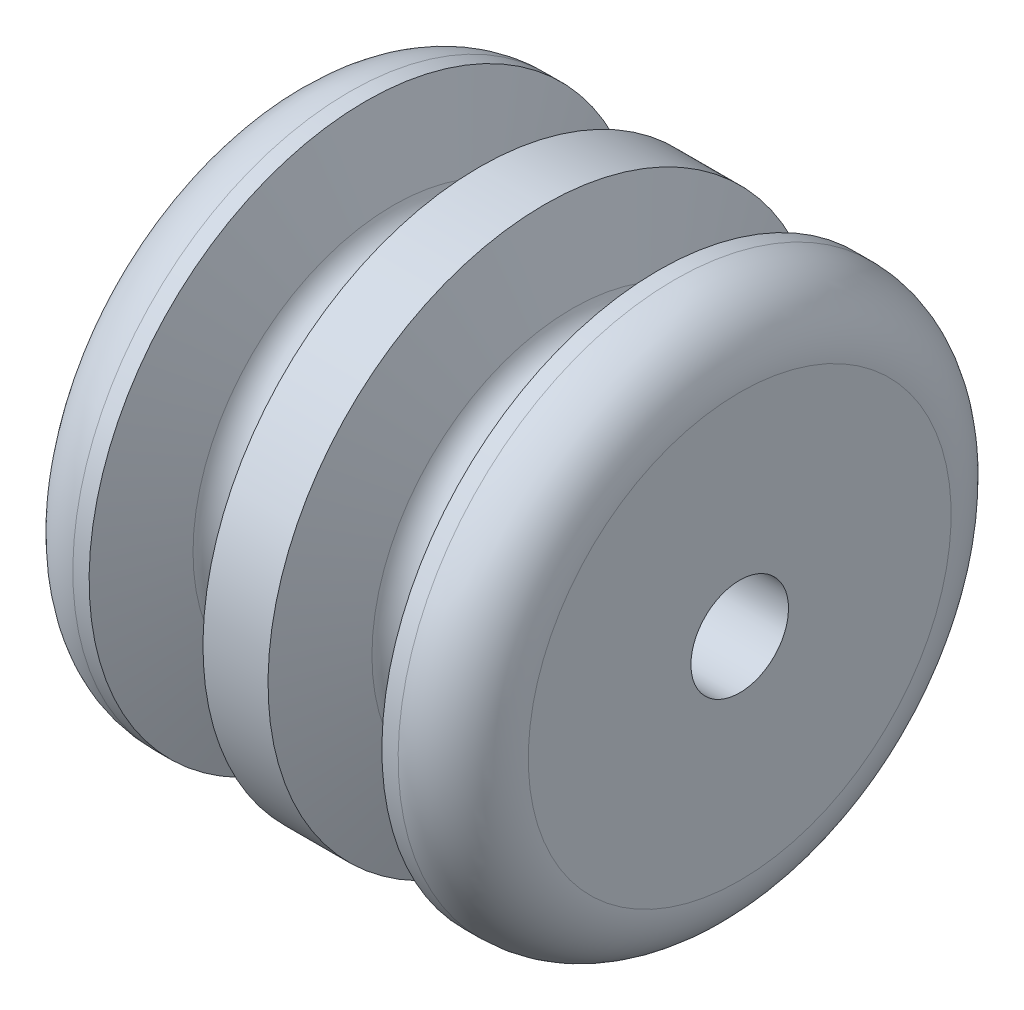
ISO-10303-21;
HEADER;
FILE_DESCRIPTION(('STEP AP214'),'2;1');
FILE_NAME('part.step','',(''),(''),'','','');
FILE_SCHEMA(('AUTOMOTIVE_DESIGN { 1 0 10303 214 1 1 1 1 }'));
ENDSEC;
DATA;
#1=APPLICATION_CONTEXT('core data for automotive mechanical design processes');
#2=APPLICATION_PROTOCOL_DEFINITION('international standard','automotive_design',2000,#1);
#3=PRODUCT_CONTEXT('',#1,'mechanical');
#4=PRODUCT('Part','Part','',(#3));
#5=PRODUCT_RELATED_PRODUCT_CATEGORY('part','',(#4));
#6=PRODUCT_DEFINITION_FORMATION('','',#4);
#7=PRODUCT_DEFINITION_CONTEXT('part definition',#1,'design');
#8=PRODUCT_DEFINITION('design','',#6,#7);
#9=PRODUCT_DEFINITION_SHAPE('','',#8);
#10=(LENGTH_UNIT() NAMED_UNIT(*) SI_UNIT(.MILLI.,.METRE.));
#11=(NAMED_UNIT(*) PLANE_ANGLE_UNIT() SI_UNIT($,.RADIAN.));
#12=(NAMED_UNIT(*) SI_UNIT($,.STERADIAN.) SOLID_ANGLE_UNIT());
#13=UNCERTAINTY_MEASURE_WITH_UNIT(LENGTH_MEASURE(1.E-05),#10,'distance_accuracy_value','');
#14=(GEOMETRIC_REPRESENTATION_CONTEXT(3) GLOBAL_UNCERTAINTY_ASSIGNED_CONTEXT((#13)) GLOBAL_UNIT_ASSIGNED_CONTEXT((#10,
#11,#12)) REPRESENTATION_CONTEXT('',''));
#15=CARTESIAN_POINT('',(0.,0.,0.));
#16=DIRECTION('',(0.,0.,1.));
#17=DIRECTION('',(1.,0.,0.));
#18=AXIS2_PLACEMENT_3D('',#15,#16,#17);
#19=CARTESIAN_POINT('',(-18.5296778492702,0.,0.));
#20=DIRECTION('',(-1.,0.,0.));
#21=DIRECTION('',(0.,-1.,0.));
#22=AXIS2_PLACEMENT_3D('',#19,#20,#21);
#23=CONICAL_SURFACE('',#22,31.2825376719056,1.22173047639603);
#24=CARTESIAN_POINT('',(-22.86,0.,0.));
#25=DIRECTION('',(1.,0.,0.));
#26=DIRECTION('',(0.,1.,0.));
#27=AXIS2_PLACEMENT_3D('',#24,#25,#26);
#28=CIRCLE('',#27,43.18);
#29=CARTESIAN_POINT('',(-22.86,43.18,0.));
#30=VERTEX_POINT('',#29);
#31=EDGE_CURVE('E10',#30,#30,#28,.T.);
#32=ORIENTED_EDGE('',*,*,#31,.T.);
#33=EDGE_LOOP('',(#32));
#34=FACE_BOUND('',#33,.T.);
#35=CARTESIAN_POINT('',(-18.5296778492702,0.,0.));
#36=DIRECTION('',(1.,0.,0.));
#37=DIRECTION('',(0.,1.,0.));
#38=AXIS2_PLACEMENT_3D('',#35,#36,#37);
#39=CIRCLE('',#38,31.2825376719056);
#40=CARTESIAN_POINT('',(-18.5296778492702,31.2825376719056,0.));
#41=VERTEX_POINT('',#40);
#42=EDGE_CURVE('E78',#41,#41,#39,.T.);
#43=ORIENTED_EDGE('',*,*,#42,.F.);
#44=EDGE_LOOP('',(#43));
#45=FACE_BOUND('',#44,.T.);
#46=ADVANCED_FACE('F38',(#34,#45),#23,.T.);
#47=CARTESIAN_POINT('',(35.56,0.,0.));
#48=DIRECTION('',(1.,0.,0.));
#49=DIRECTION('',(0.,1.,0.));
#50=AXIS2_PLACEMENT_3D('',#47,#48,#49);
#51=CYLINDRICAL_SURFACE('',#50,43.18);
#52=CARTESIAN_POINT('',(-25.4,0.,0.));
#53=DIRECTION('',(1.,0.,0.));
#54=DIRECTION('',(0.,1.,0.));
#55=AXIS2_PLACEMENT_3D('',#52,#53,#54);
#56=CIRCLE('',#55,43.18);
#57=CARTESIAN_POINT('',(-25.4,43.18,0.));
#58=VERTEX_POINT('',#57);
#59=EDGE_CURVE('E44',#58,#58,#56,.T.);
#60=ORIENTED_EDGE('',*,*,#59,.T.);
#61=EDGE_LOOP('',(#60));
#62=FACE_BOUND('',#61,.T.);
#63=ORIENTED_EDGE('',*,*,#31,.F.);
#64=EDGE_LOOP('',(#63));
#65=FACE_BOUND('',#64,.T.);
#66=ADVANCED_FACE('F116',(#62,#65),#51,.T.);
#67=CARTESIAN_POINT('',(-25.4,0.,0.));
#68=DIRECTION('',(1.,0.,0.));
#69=DIRECTION('',(0.,1.,0.));
#70=AXIS2_PLACEMENT_3D('',#67,#68,#69);
#71=TOROIDAL_SURFACE('',#70,33.02,10.16);
#72=CARTESIAN_POINT('',(-35.56,0.,0.));
#73=DIRECTION('',(1.,0.,0.));
#74=DIRECTION('',(0.,1.,0.));
#75=AXIS2_PLACEMENT_3D('',#72,#73,#74);
#76=CIRCLE('',#75,33.02);
#77=CARTESIAN_POINT('',(-35.56,33.02,0.));
#78=VERTEX_POINT('',#77);
#79=EDGE_CURVE('E48',#78,#78,#76,.T.);
#80=ORIENTED_EDGE('',*,*,#79,.T.);
#81=EDGE_LOOP('',(#80));
#82=FACE_BOUND('',#81,.T.);
#83=ORIENTED_EDGE('',*,*,#59,.F.);
#84=EDGE_LOOP('',(#83));
#85=FACE_BOUND('',#84,.T.);
#86=ADVANCED_FACE('F120',(#82,#85),#71,.T.);
#87=CARTESIAN_POINT('',(-35.56,0.,0.));
#88=DIRECTION('',(-1.,0.,0.));
#89=DIRECTION('',(0.,-1.,0.));
#90=AXIS2_PLACEMENT_3D('',#87,#88,#89);
#91=PLANE('',#90);
#92=CARTESIAN_POINT('',(-35.56,0.,0.));
#93=DIRECTION('',(1.,0.,0.));
#94=DIRECTION('',(0.,1.,0.));
#95=AXIS2_PLACEMENT_3D('',#92,#93,#94);
#96=CIRCLE('',#95,7.62);
#97=CARTESIAN_POINT('',(-35.56,7.61999999999999,0.));
#98=VERTEX_POINT('',#97);
#99=EDGE_CURVE('E81',#98,#98,#96,.T.);
#100=ORIENTED_EDGE('',*,*,#99,.T.);
#101=EDGE_LOOP('',(#100));
#102=FACE_BOUND('',#101,.T.);
#103=ORIENTED_EDGE('',*,*,#79,.F.);
#104=EDGE_LOOP('',(#103));
#105=FACE_BOUND('',#104,.T.);
#106=ADVANCED_FACE('F88',(#102,#105),#91,.T.);
#107=CARTESIAN_POINT('',(35.56,0.,0.));
#108=DIRECTION('',(1.,0.,0.));
#109=DIRECTION('',(0.,1.,0.));
#110=AXIS2_PLACEMENT_3D('',#107,#108,#109);
#111=PLANE('',#110);
#112=CARTESIAN_POINT('',(35.56,0.,0.));
#113=DIRECTION('',(1.,0.,0.));
#114=DIRECTION('',(0.,1.,0.));
#115=AXIS2_PLACEMENT_3D('',#112,#113,#114);
#116=CIRCLE('',#115,7.62);
#117=CARTESIAN_POINT('',(35.56,7.62,0.));
#118=VERTEX_POINT('',#117);
#119=EDGE_CURVE('E82',#118,#118,#116,.T.);
#120=ORIENTED_EDGE('',*,*,#119,.F.);
#121=EDGE_LOOP('',(#120));
#122=FACE_BOUND('',#121,.T.);
#123=CARTESIAN_POINT('',(35.56,0.,0.));
#124=DIRECTION('',(1.,0.,0.));
#125=DIRECTION('',(0.,1.,0.));
#126=AXIS2_PLACEMENT_3D('',#123,#124,#125);
#127=CIRCLE('',#126,33.02);
#128=CARTESIAN_POINT('',(35.56,33.02,0.));
#129=VERTEX_POINT('',#128);
#130=EDGE_CURVE('E52',#129,#129,#127,.T.);
#131=ORIENTED_EDGE('',*,*,#130,.T.);
#132=EDGE_LOOP('',(#131));
#133=FACE_BOUND('',#132,.T.);
#134=ADVANCED_FACE('F98',(#122,#133),#111,.T.);
#135=CARTESIAN_POINT('',(25.4,0.,0.));
#136=DIRECTION('',(1.,0.,0.));
#137=DIRECTION('',(0.,1.,0.));
#138=AXIS2_PLACEMENT_3D('',#135,#136,#137);
#139=TOROIDAL_SURFACE('',#138,33.02,10.16);
#140=CARTESIAN_POINT('',(25.4,0.,0.));
#141=DIRECTION('',(1.,0.,0.));
#142=DIRECTION('',(0.,1.,0.));
#143=AXIS2_PLACEMENT_3D('',#140,#141,#142);
#144=CIRCLE('',#143,43.18);
#145=CARTESIAN_POINT('',(25.4,43.18,0.));
#146=VERTEX_POINT('',#145);
#147=EDGE_CURVE('E57',#146,#146,#144,.T.);
#148=ORIENTED_EDGE('',*,*,#147,.T.);
#149=EDGE_LOOP('',(#148));
#150=FACE_BOUND('',#149,.T.);
#151=ORIENTED_EDGE('',*,*,#130,.F.);
#152=EDGE_LOOP('',(#151));
#153=FACE_BOUND('',#152,.T.);
#154=ADVANCED_FACE('F101',(#150,#153),#139,.T.);
#155=CARTESIAN_POINT('',(35.56,0.,0.));
#156=DIRECTION('',(1.,0.,0.));
#157=DIRECTION('',(0.,1.,0.));
#158=AXIS2_PLACEMENT_3D('',#155,#156,#157);
#159=CYLINDRICAL_SURFACE('',#158,43.18);
#160=CARTESIAN_POINT('',(22.86,0.,0.));
#161=DIRECTION('',(1.,0.,0.));
#162=DIRECTION('',(0.,1.,0.));
#163=AXIS2_PLACEMENT_3D('',#160,#161,#162);
#164=CIRCLE('',#163,43.18);
#165=CARTESIAN_POINT('',(22.86,43.18,0.));
#166=VERTEX_POINT('',#165);
#167=EDGE_CURVE('E60',#166,#166,#164,.T.);
#168=ORIENTED_EDGE('',*,*,#167,.T.);
#169=EDGE_LOOP('',(#168));
#170=FACE_BOUND('',#169,.T.);
#171=ORIENTED_EDGE('',*,*,#147,.F.);
#172=EDGE_LOOP('',(#171));
#173=FACE_BOUND('',#172,.T.);
#174=ADVANCED_FACE('F106',(#170,#173),#159,.T.);
#175=CARTESIAN_POINT('',(22.86,0.,0.));
#176=DIRECTION('',(1.,0.,0.));
#177=DIRECTION('',(0.,1.,0.));
#178=AXIS2_PLACEMENT_3D('',#175,#176,#177);
#179=CONICAL_SURFACE('',#178,43.18,1.22173047639603);
#180=CARTESIAN_POINT('',(18.5296778492702,0.,0.));
#181=DIRECTION('',(1.,0.,0.));
#182=DIRECTION('',(0.,1.,0.));
#183=AXIS2_PLACEMENT_3D('',#180,#181,#182);
#184=CIRCLE('',#183,31.2825376719056);
#185=CARTESIAN_POINT('',(18.5296778492702,31.2825376719056,0.));
#186=VERTEX_POINT('',#185);
#187=EDGE_CURVE('E63',#186,#186,#184,.T.);
#188=ORIENTED_EDGE('',*,*,#187,.T.);
#189=EDGE_LOOP('',(#188));
#190=FACE_BOUND('',#189,.T.);
#191=ORIENTED_EDGE('',*,*,#167,.F.);
#192=EDGE_LOOP('',(#191));
#193=FACE_BOUND('',#192,.T.);
#194=ADVANCED_FACE('F112',(#190,#193),#179,.T.);
#195=CARTESIAN_POINT('',(13.97,0.,0.));
#196=DIRECTION('',(1.,0.,0.));
#197=DIRECTION('',(0.,1.,0.));
#198=AXIS2_PLACEMENT_3D('',#195,#196,#197);
#199=TOROIDAL_SURFACE('',#198,32.9421246868829,4.85230781684412);
#200=CARTESIAN_POINT('',(9.41032215072978,0.,0.));
#201=DIRECTION('',(1.,0.,0.));
#202=DIRECTION('',(0.,1.,0.));
#203=AXIS2_PLACEMENT_3D('',#200,#201,#202);
#204=CIRCLE('',#203,31.2825376719056);
#205=CARTESIAN_POINT('',(9.41032215072978,31.2825376719056,0.));
#206=VERTEX_POINT('',#205);
#207=EDGE_CURVE('E66',#206,#206,#204,.T.);
#208=ORIENTED_EDGE('',*,*,#207,.T.);
#209=EDGE_LOOP('',(#208));
#210=FACE_BOUND('',#209,.T.);
#211=ORIENTED_EDGE('',*,*,#187,.F.);
#212=EDGE_LOOP('',(#211));
#213=FACE_BOUND('',#212,.T.);
#214=ADVANCED_FACE('F144',(#210,#213),#199,.F.);
#215=CARTESIAN_POINT('',(9.41032215072978,0.,0.));
#216=DIRECTION('',(-1.,0.,0.));
#217=DIRECTION('',(0.,-1.,0.));
#218=AXIS2_PLACEMENT_3D('',#215,#216,#217);
#219=CONICAL_SURFACE('',#218,31.2825376719056,1.22173047639603);
#220=CARTESIAN_POINT('',(5.08000000000001,0.,0.));
#221=DIRECTION('',(1.,0.,0.));
#222=DIRECTION('',(0.,1.,0.));
#223=AXIS2_PLACEMENT_3D('',#220,#221,#222);
#224=CIRCLE('',#223,43.18);
#225=CARTESIAN_POINT('',(5.08000000000001,43.18,0.));
#226=VERTEX_POINT('',#225);
#227=EDGE_CURVE('E69',#226,#226,#224,.T.);
#228=ORIENTED_EDGE('',*,*,#227,.T.);
#229=EDGE_LOOP('',(#228));
#230=FACE_BOUND('',#229,.T.);
#231=ORIENTED_EDGE('',*,*,#207,.F.);
#232=EDGE_LOOP('',(#231));
#233=FACE_BOUND('',#232,.T.);
#234=ADVANCED_FACE('F138',(#230,#233),#219,.T.);
#235=CARTESIAN_POINT('',(35.56,0.,0.));
#236=DIRECTION('',(1.,0.,0.));
#237=DIRECTION('',(0.,1.,0.));
#238=AXIS2_PLACEMENT_3D('',#235,#236,#237);
#239=CYLINDRICAL_SURFACE('',#238,43.18);
#240=CARTESIAN_POINT('',(-5.07999999999999,0.,0.));
#241=DIRECTION('',(1.,0.,0.));
#242=DIRECTION('',(0.,1.,0.));
#243=AXIS2_PLACEMENT_3D('',#240,#241,#242);
#244=CIRCLE('',#243,43.18);
#245=CARTESIAN_POINT('',(-5.07999999999999,43.18,0.));
#246=VERTEX_POINT('',#245);
#247=EDGE_CURVE('E72',#246,#246,#244,.T.);
#248=ORIENTED_EDGE('',*,*,#247,.T.);
#249=EDGE_LOOP('',(#248));
#250=FACE_BOUND('',#249,.T.);
#251=ORIENTED_EDGE('',*,*,#227,.F.);
#252=EDGE_LOOP('',(#251));
#253=FACE_BOUND('',#252,.T.);
#254=ADVANCED_FACE('F132',(#250,#253),#239,.T.);
#255=CARTESIAN_POINT('',(-5.07999999999999,0.,0.));
#256=DIRECTION('',(1.,0.,0.));
#257=DIRECTION('',(0.,1.,0.));
#258=AXIS2_PLACEMENT_3D('',#255,#256,#257);
#259=CONICAL_SURFACE('',#258,43.18,1.22173047639603);
#260=CARTESIAN_POINT('',(-9.41032215072977,0.,0.));
#261=DIRECTION('',(1.,0.,0.));
#262=DIRECTION('',(0.,1.,0.));
#263=AXIS2_PLACEMENT_3D('',#260,#261,#262);
#264=CIRCLE('',#263,31.2825376719056);
#265=CARTESIAN_POINT('',(-9.41032215072977,31.2825376719056,0.));
#266=VERTEX_POINT('',#265);
#267=EDGE_CURVE('E75',#266,#266,#264,.T.);
#268=ORIENTED_EDGE('',*,*,#267,.T.);
#269=EDGE_LOOP('',(#268));
#270=FACE_BOUND('',#269,.T.);
#271=ORIENTED_EDGE('',*,*,#247,.F.);
#272=EDGE_LOOP('',(#271));
#273=FACE_BOUND('',#272,.T.);
#274=ADVANCED_FACE('F126',(#270,#273),#259,.T.);
#275=CARTESIAN_POINT('',(-13.97,0.,0.));
#276=DIRECTION('',(1.,0.,0.));
#277=DIRECTION('',(0.,1.,0.));
#278=AXIS2_PLACEMENT_3D('',#275,#276,#277);
#279=TOROIDAL_SURFACE('',#278,32.9421246868829,4.85230781684413);
#280=ORIENTED_EDGE('',*,*,#42,.T.);
#281=EDGE_LOOP('',(#280));
#282=FACE_BOUND('',#281,.T.);
#283=ORIENTED_EDGE('',*,*,#267,.F.);
#284=EDGE_LOOP('',(#283));
#285=FACE_BOUND('',#284,.T.);
#286=ADVANCED_FACE('F94',(#282,#285),#279,.F.);
#287=CARTESIAN_POINT('',(-35.56,0.,0.));
#288=DIRECTION('',(1.,0.,0.));
#289=DIRECTION('',(0.,1.,0.));
#290=AXIS2_PLACEMENT_3D('',#287,#288,#289);
#291=CYLINDRICAL_SURFACE('',#290,7.62);
#292=ORIENTED_EDGE('',*,*,#99,.F.);
#293=EDGE_LOOP('',(#292));
#294=FACE_BOUND('',#293,.T.);
#295=ORIENTED_EDGE('',*,*,#119,.T.);
#296=EDGE_LOOP('',(#295));
#297=FACE_BOUND('',#296,.T.);
#298=ADVANCED_FACE('F91',(#294,#297),#291,.F.);
#299=CLOSED_SHELL('',(#46,#66,#86,#106,#134,#154,#174,#194,#214,#234,#254,#274,#286,#298));
#300=MANIFOLD_SOLID_BREP('B2',#299);
#301=ADVANCED_BREP_SHAPE_REPRESENTATION('',(#18,#300),#14);
#302=SHAPE_DEFINITION_REPRESENTATION(#9,#301);
ENDSEC;
END-ISO-10303-21;
